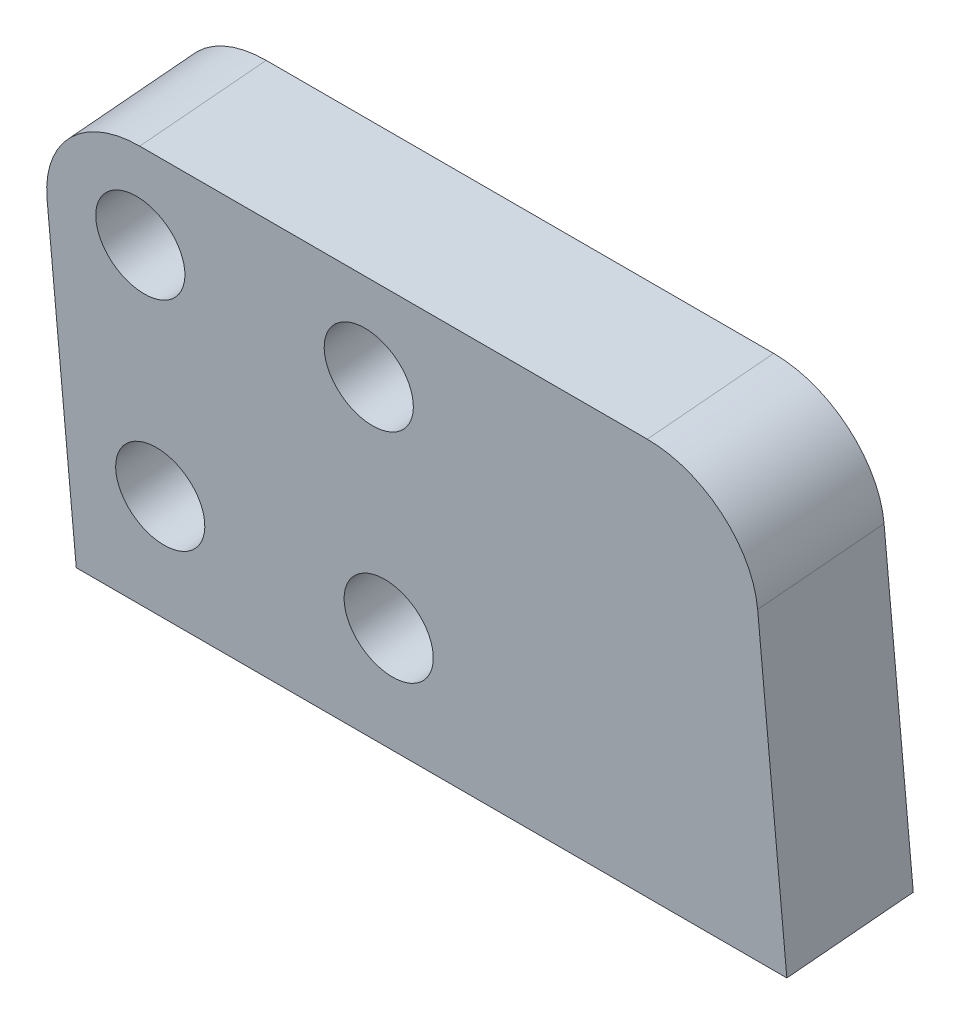
ISO-10303-21;
HEADER;
FILE_DESCRIPTION(('STEP AP214'),'2;1');
FILE_NAME('part.step','',(''),(''),'','','');
FILE_SCHEMA(('AUTOMOTIVE_DESIGN { 1 0 10303 214 1 1 1 1 }'));
ENDSEC;
DATA;
#1=APPLICATION_CONTEXT('core data for automotive mechanical design processes');
#2=APPLICATION_PROTOCOL_DEFINITION('international standard','automotive_design',2000,#1);
#3=PRODUCT_CONTEXT('',#1,'mechanical');
#4=PRODUCT('Part','Part','',(#3));
#5=PRODUCT_RELATED_PRODUCT_CATEGORY('part','',(#4));
#6=PRODUCT_DEFINITION_FORMATION('','',#4);
#7=PRODUCT_DEFINITION_CONTEXT('part definition',#1,'design');
#8=PRODUCT_DEFINITION('design','',#6,#7);
#9=PRODUCT_DEFINITION_SHAPE('','',#8);
#10=(LENGTH_UNIT() NAMED_UNIT(*) SI_UNIT(.MILLI.,.METRE.));
#11=(NAMED_UNIT(*) PLANE_ANGLE_UNIT() SI_UNIT($,.RADIAN.));
#12=(NAMED_UNIT(*) SI_UNIT($,.STERADIAN.) SOLID_ANGLE_UNIT());
#13=UNCERTAINTY_MEASURE_WITH_UNIT(LENGTH_MEASURE(1.E-05),#10,'distance_accuracy_value','');
#14=(GEOMETRIC_REPRESENTATION_CONTEXT(3) GLOBAL_UNCERTAINTY_ASSIGNED_CONTEXT((#13)) GLOBAL_UNIT_ASSIGNED_CONTEXT((#10,
#11,#12)) REPRESENTATION_CONTEXT('',''));
#15=CARTESIAN_POINT('',(0.,0.,0.));
#16=DIRECTION('',(0.,0.,1.));
#17=DIRECTION('',(1.,0.,0.));
#18=AXIS2_PLACEMENT_3D('',#15,#16,#17);
#19=CARTESIAN_POINT('',(-9.39850038185257,-99.6092322077506,29.3696279563749));
#20=DIRECTION('',(0.,0.996194698091746,0.087155742747658));
#21=DIRECTION('',(0.,-0.087155742747658,0.996194698091746));
#22=AXIS2_PLACEMENT_3D('',#19,#20,#21);
#23=PLANE('',#22);
#24=DIRECTION('',(1.,0.,0.));
#25=VECTOR('',#24,1.);
#26=CARTESIAN_POINT('',(-34.0999576101563,-100.480789635227,39.3315749372924));
#27=LINE('',#26,#25);
#28=CARTESIAN_POINT('',(-80.0899576101563,-100.480789635227,39.3315749372924));
#29=VERTEX_POINT('',#28);
#30=CARTESIAN_POINT('',(-24.0999576101563,-100.480789635227,39.3315749372924));
#31=VERTEX_POINT('',#30);
#32=EDGE_CURVE('E50',#29,#31,#27,.T.);
#33=ORIENTED_EDGE('',*,*,#32,.F.);
#34=DIRECTION('',(0.,-0.087155742747658,0.996194698091746));
#35=VECTOR('',#34,1.);
#36=CARTESIAN_POINT('',(-80.0899576101563,-100.480789635227,39.3315749372924));
#37=LINE('',#36,#35);
#38=CARTESIAN_POINT('',(-80.0899576101563,-99.6092322077506,29.3696279563749));
#39=VERTEX_POINT('',#38);
#40=EDGE_CURVE('E134',#39,#29,#37,.T.);
#41=ORIENTED_EDGE('',*,*,#40,.F.);
#42=DIRECTION('',(1.,0.,0.));
#43=VECTOR('',#42,1.);
#44=CARTESIAN_POINT('',(-34.0999576101563,-99.6092322077506,29.3696279563749));
#45=LINE('',#44,#43);
#46=CARTESIAN_POINT('',(-24.0999576101563,-99.6092322077506,29.3696279563749));
#47=VERTEX_POINT('',#46);
#48=EDGE_CURVE('E11',#39,#47,#45,.T.);
#49=ORIENTED_EDGE('',*,*,#48,.T.);
#50=DIRECTION('',(0.,0.087155742747658,-0.996194698091746));
#51=VECTOR('',#50,1.);
#52=CARTESIAN_POINT('',(-24.0999576101563,-100.480789635227,39.3315749372924));
#53=LINE('',#52,#51);
#54=EDGE_CURVE('E44',#31,#47,#53,.T.);
#55=ORIENTED_EDGE('',*,*,#54,.F.);
#56=EDGE_LOOP('',(#33,#41,#49,#55));
#57=FACE_BOUND('',#56,.T.);
#58=ADVANCED_FACE('F41',(#57),#23,.F.);
#59=CARTESIAN_POINT('',(-72.6899576101563,-91.5150373524014,40.1159766220213));
#60=DIRECTION('',(0.,0.087155742747658,-0.996194698091746));
#61=DIRECTION('',(-1.,0.,0.));
#62=AXIS2_PLACEMENT_3D('',#59,#60,#61);
#63=CYLINDRICAL_SURFACE('',#62,3.5);
#64=CARTESIAN_POINT('',(-72.6899576101563,-91.5150373524014,40.1159766220213));
#65=DIRECTION('',(0.,-0.087155742747658,0.996194698091746));
#66=DIRECTION('',(1.,0.,0.));
#67=AXIS2_PLACEMENT_3D('',#64,#65,#66);
#68=CIRCLE('',#67,3.5);
#69=CARTESIAN_POINT('',(-69.1899576101563,-91.5150373524014,40.1159766220213));
#70=VERTEX_POINT('',#69);
#71=EDGE_CURVE('E291',#70,#70,#68,.T.);
#72=ORIENTED_EDGE('',*,*,#71,.T.);
#73=EDGE_LOOP('',(#72));
#74=FACE_BOUND('',#73,.T.);
#75=CARTESIAN_POINT('',(-72.6899576101563,-90.6434799249248,30.1540296411039));
#76=DIRECTION('',(0.,-0.087155742747658,0.996194698091746));
#77=DIRECTION('',(1.,0.,0.));
#78=AXIS2_PLACEMENT_3D('',#75,#76,#77);
#79=CIRCLE('',#78,3.5);
#80=CARTESIAN_POINT('',(-69.1899576101563,-90.6434799249248,30.1540296411039));
#81=VERTEX_POINT('',#80);
#82=EDGE_CURVE('E289',#81,#81,#79,.T.);
#83=ORIENTED_EDGE('',*,*,#82,.F.);
#84=EDGE_LOOP('',(#83));
#85=FACE_BOUND('',#84,.T.);
#86=ADVANCED_FACE('F163',(#74,#85),#63,.F.);
#87=CARTESIAN_POINT('',(-54.6899576101563,-73.58353278675,41.6847799914792));
#88=DIRECTION('',(0.,0.087155742747658,-0.996194698091746));
#89=DIRECTION('',(-1.,0.,0.));
#90=AXIS2_PLACEMENT_3D('',#87,#88,#89);
#91=CYLINDRICAL_SURFACE('',#90,3.5);
#92=CARTESIAN_POINT('',(-54.6899576101563,-73.58353278675,41.6847799914792));
#93=DIRECTION('',(0.,-0.087155742747658,0.996194698091746));
#94=DIRECTION('',(1.,0.,0.));
#95=AXIS2_PLACEMENT_3D('',#92,#93,#94);
#96=CIRCLE('',#95,3.5);
#97=CARTESIAN_POINT('',(-51.1899576101563,-73.58353278675,41.6847799914792));
#98=VERTEX_POINT('',#97);
#99=EDGE_CURVE('E269',#98,#98,#96,.T.);
#100=ORIENTED_EDGE('',*,*,#99,.T.);
#101=EDGE_LOOP('',(#100));
#102=FACE_BOUND('',#101,.T.);
#103=CARTESIAN_POINT('',(-54.6899576101563,-72.7119753592734,31.7228330105617));
#104=DIRECTION('',(0.,-0.087155742747658,0.996194698091746));
#105=DIRECTION('',(1.,0.,0.));
#106=AXIS2_PLACEMENT_3D('',#103,#104,#105);
#107=CIRCLE('',#106,3.5);
#108=CARTESIAN_POINT('',(-51.1899576101563,-72.7119753592734,31.7228330105617));
#109=VERTEX_POINT('',#108);
#110=EDGE_CURVE('E272',#109,#109,#107,.T.);
#111=ORIENTED_EDGE('',*,*,#110,.F.);
#112=EDGE_LOOP('',(#111));
#113=FACE_BOUND('',#112,.T.);
#114=ADVANCED_FACE('F167',(#102,#113),#91,.F.);
#115=CARTESIAN_POINT('',(-54.6899576101563,-91.5150373524014,40.1159766220213));
#116=DIRECTION('',(0.,0.087155742747658,-0.996194698091746));
#117=DIRECTION('',(-1.,0.,0.));
#118=AXIS2_PLACEMENT_3D('',#115,#116,#117);
#119=CYLINDRICAL_SURFACE('',#118,3.5);
#120=CARTESIAN_POINT('',(-54.6899576101563,-91.5150373524014,40.1159766220213));
#121=DIRECTION('',(0.,-0.087155742747658,0.996194698091746));
#122=DIRECTION('',(1.,0.,0.));
#123=AXIS2_PLACEMENT_3D('',#120,#121,#122);
#124=CIRCLE('',#123,3.5);
#125=CARTESIAN_POINT('',(-51.1899576101563,-91.5150373524014,40.1159766220213));
#126=VERTEX_POINT('',#125);
#127=EDGE_CURVE('E100',#126,#126,#124,.T.);
#128=ORIENTED_EDGE('',*,*,#127,.T.);
#129=EDGE_LOOP('',(#128));
#130=FACE_BOUND('',#129,.T.);
#131=CARTESIAN_POINT('',(-54.6899576101563,-90.6434799249248,30.1540296411039));
#132=DIRECTION('',(0.,-0.087155742747658,0.996194698091746));
#133=DIRECTION('',(1.,0.,0.));
#134=AXIS2_PLACEMENT_3D('',#131,#132,#133);
#135=CIRCLE('',#134,3.5);
#136=CARTESIAN_POINT('',(-51.1899576101563,-90.6434799249248,30.1540296411039));
#137=VERTEX_POINT('',#136);
#138=EDGE_CURVE('E149',#137,#137,#135,.T.);
#139=ORIENTED_EDGE('',*,*,#138,.F.);
#140=EDGE_LOOP('',(#139));
#141=FACE_BOUND('',#140,.T.);
#142=ADVANCED_FACE('F187',(#130,#141),#119,.F.);
#143=CARTESIAN_POINT('',(-72.6899576101563,-73.58353278675,41.6847799914792));
#144=DIRECTION('',(0.,0.087155742747658,-0.996194698091746));
#145=DIRECTION('',(-1.,0.,0.));
#146=AXIS2_PLACEMENT_3D('',#143,#144,#145);
#147=CYLINDRICAL_SURFACE('',#146,3.5);
#148=CARTESIAN_POINT('',(-72.6899576101563,-73.58353278675,41.6847799914792));
#149=DIRECTION('',(0.,-0.087155742747658,0.996194698091746));
#150=DIRECTION('',(1.,0.,0.));
#151=AXIS2_PLACEMENT_3D('',#148,#149,#150);
#152=CIRCLE('',#151,3.5);
#153=CARTESIAN_POINT('',(-69.1899576101563,-73.58353278675,41.6847799914792));
#154=VERTEX_POINT('',#153);
#155=EDGE_CURVE('E274',#154,#154,#152,.T.);
#156=ORIENTED_EDGE('',*,*,#155,.T.);
#157=EDGE_LOOP('',(#156));
#158=FACE_BOUND('',#157,.T.);
#159=CARTESIAN_POINT('',(-72.6899576101563,-72.7119753592734,31.7228330105617));
#160=DIRECTION('',(0.,-0.087155742747658,0.996194698091746));
#161=DIRECTION('',(1.,0.,0.));
#162=AXIS2_PLACEMENT_3D('',#159,#160,#161);
#163=CIRCLE('',#162,3.5);
#164=CARTESIAN_POINT('',(-69.1899576101563,-72.7119753592734,31.7228330105617));
#165=VERTEX_POINT('',#164);
#166=EDGE_CURVE('E277',#165,#165,#163,.T.);
#167=ORIENTED_EDGE('',*,*,#166,.F.);
#168=EDGE_LOOP('',(#167));
#169=FACE_BOUND('',#168,.T.);
#170=ADVANCED_FACE('F183',(#158,#169),#147,.F.);
#171=CARTESIAN_POINT('',(-80.0899576101563,-66.2116920208711,42.3297324878118));
#172=DIRECTION('',(0.,-0.996194698091746,-0.087155742747658));
#173=DIRECTION('',(0.,0.087155742747658,-0.996194698091746));
#174=AXIS2_PLACEMENT_3D('',#171,#172,#173);
#175=PLANE('',#174);
#176=DIRECTION('',(-1.,0.,0.));
#177=VECTOR('',#176,1.);
#178=CARTESIAN_POINT('',(-80.0899576101563,-65.3401345933945,32.3677855068944));
#179=LINE('',#178,#177);
#180=CARTESIAN_POINT('',(-32.0999576101563,-65.3401345933945,32.3677855068944));
#181=VERTEX_POINT('',#180);
#182=CARTESIAN_POINT('',(-72.0899576101563,-65.3401345933945,32.3677855068944));
#183=VERTEX_POINT('',#182);
#184=EDGE_CURVE('E99',#181,#183,#179,.T.);
#185=ORIENTED_EDGE('',*,*,#184,.T.);
#186=DIRECTION('',(0.,0.087155742747658,-0.996194698091746));
#187=VECTOR('',#186,1.);
#188=CARTESIAN_POINT('',(-72.0899576101563,-66.2116920208711,42.3297324878118));
#189=LINE('',#188,#187);
#190=CARTESIAN_POINT('',(-72.0899576101563,-66.2116920208711,42.3297324878118));
#191=VERTEX_POINT('',#190);
#192=EDGE_CURVE('E132',#183,#191,#189,.F.);
#193=ORIENTED_EDGE('',*,*,#192,.T.);
#194=DIRECTION('',(-1.,0.,0.));
#195=VECTOR('',#194,1.);
#196=CARTESIAN_POINT('',(-80.0899576101563,-66.2116920208711,42.3297324878118));
#197=LINE('',#196,#195);
#198=CARTESIAN_POINT('',(-32.0999576101563,-66.2116920208711,42.3297324878118));
#199=VERTEX_POINT('',#198);
#200=EDGE_CURVE('E117',#199,#191,#197,.T.);
#201=ORIENTED_EDGE('',*,*,#200,.F.);
#202=DIRECTION('',(0.,0.087155742747658,-0.996194698091746));
#203=VECTOR('',#202,1.);
#204=CARTESIAN_POINT('',(-32.0999576101563,-66.2116920208711,42.3297324878118));
#205=LINE('',#204,#203);
#206=EDGE_CURVE('E130',#199,#181,#205,.T.);
#207=ORIENTED_EDGE('',*,*,#206,.T.);
#208=EDGE_LOOP('',(#185,#193,#201,#207));
#209=FACE_BOUND('',#208,.T.);
#210=ADVANCED_FACE('F153',(#209),#175,.F.);
#211=CARTESIAN_POINT('',(-32.0999576101563,-74.1812496056051,41.6324865458306));
#212=DIRECTION('',(0.,0.087155742747658,-0.996194698091746));
#213=DIRECTION('',(-1.,0.,0.));
#214=AXIS2_PLACEMENT_3D('',#211,#212,#213);
#215=CYLINDRICAL_SURFACE('',#214,8.);
#216=CARTESIAN_POINT('',(-32.0999576101563,-74.1812496056051,41.6324865458306));
#217=DIRECTION('',(0.,0.087155742747658,-0.996194698091746));
#218=DIRECTION('',(-1.,0.,0.));
#219=AXIS2_PLACEMENT_3D('',#216,#217,#218);
#220=CIRCLE('',#219,8.);
#221=CARTESIAN_POINT('',(-24.0999576101563,-74.1812496056051,41.6324865458306));
#222=VERTEX_POINT('',#221);
#223=EDGE_CURVE('E113',#222,#199,#220,.F.);
#224=ORIENTED_EDGE('',*,*,#223,.F.);
#225=DIRECTION('',(0.,0.087155742747658,-0.996194698091746));
#226=VECTOR('',#225,1.);
#227=CARTESIAN_POINT('',(-24.0999576101563,-74.1812496056051,41.6324865458306));
#228=LINE('',#227,#226);
#229=CARTESIAN_POINT('',(-24.0999576101563,-73.3096921781285,31.6705395649131));
#230=VERTEX_POINT('',#229);
#231=EDGE_CURVE('E96',#230,#222,#228,.F.);
#232=ORIENTED_EDGE('',*,*,#231,.F.);
#233=CARTESIAN_POINT('',(-32.0999576101563,-73.3096921781285,31.6705395649131));
#234=DIRECTION('',(0.,0.087155742747658,-0.996194698091746));
#235=DIRECTION('',(-1.,0.,0.));
#236=AXIS2_PLACEMENT_3D('',#233,#234,#235);
#237=CIRCLE('',#236,8.);
#238=EDGE_CURVE('E103',#181,#230,#237,.T.);
#239=ORIENTED_EDGE('',*,*,#238,.F.);
#240=ORIENTED_EDGE('',*,*,#206,.F.);
#241=EDGE_LOOP('',(#224,#232,#239,#240));
#242=FACE_BOUND('',#241,.T.);
#243=ADVANCED_FACE('F112',(#242),#215,.T.);
#244=CARTESIAN_POINT('',(-72.0899576101563,-74.1812496056051,41.6324865458306));
#245=DIRECTION('',(0.,0.087155742747658,-0.996194698091746));
#246=DIRECTION('',(-1.,0.,0.));
#247=AXIS2_PLACEMENT_3D('',#244,#245,#246);
#248=CYLINDRICAL_SURFACE('',#247,8.);
#249=CARTESIAN_POINT('',(-72.0899576101563,-74.1812496056051,41.6324865458306));
#250=DIRECTION('',(0.,0.087155742747658,-0.996194698091746));
#251=DIRECTION('',(-1.,0.,0.));
#252=AXIS2_PLACEMENT_3D('',#249,#250,#251);
#253=CIRCLE('',#252,8.);
#254=CARTESIAN_POINT('',(-80.0899576101563,-74.1812496056051,41.6324865458306));
#255=VERTEX_POINT('',#254);
#256=EDGE_CURVE('E125',#191,#255,#253,.F.);
#257=ORIENTED_EDGE('',*,*,#256,.F.);
#258=ORIENTED_EDGE('',*,*,#192,.F.);
#259=CARTESIAN_POINT('',(-72.0899576101563,-73.3096921781285,31.6705395649131));
#260=DIRECTION('',(0.,0.087155742747658,-0.996194698091746));
#261=DIRECTION('',(-1.,0.,0.));
#262=AXIS2_PLACEMENT_3D('',#259,#260,#261);
#263=CIRCLE('',#262,8.);
#264=CARTESIAN_POINT('',(-80.0899576101563,-73.3096921781285,31.6705395649131));
#265=VERTEX_POINT('',#264);
#266=EDGE_CURVE('E110',#265,#183,#263,.T.);
#267=ORIENTED_EDGE('',*,*,#266,.F.);
#268=DIRECTION('',(0.,0.087155742747658,-0.996194698091746));
#269=VECTOR('',#268,1.);
#270=CARTESIAN_POINT('',(-80.0899576101563,-74.1812496056051,41.6324865458306));
#271=LINE('',#270,#269);
#272=EDGE_CURVE('E127',#255,#265,#271,.T.);
#273=ORIENTED_EDGE('',*,*,#272,.F.);
#274=EDGE_LOOP('',(#257,#258,#267,#273));
#275=FACE_BOUND('',#274,.T.);
#276=ADVANCED_FACE('F157',(#275),#248,.T.);
#277=CARTESIAN_POINT('',(-34.0999576101563,-141.324772256989,35.7581894846384));
#278=DIRECTION('',(0.,0.087155742747658,-0.996194698091746));
#279=DIRECTION('',(-1.,0.,0.));
#280=AXIS2_PLACEMENT_3D('',#277,#278,#279);
#281=PLANE('',#280);
#282=DIRECTION('',(0.,-0.996194698091746,-0.087155742747658));
#283=VECTOR('',#282,1.);
#284=CARTESIAN_POINT('',(-80.0899576101563,-153.777205983136,34.6687427002927));
#285=LINE('',#284,#283);
#286=EDGE_CURVE('E114',#255,#29,#285,.T.);
#287=ORIENTED_EDGE('',*,*,#286,.T.);
#288=ORIENTED_EDGE('',*,*,#32,.T.);
#289=DIRECTION('',(0.,0.996194698091746,0.087155742747658));
#290=VECTOR('',#289,1.);
#291=CARTESIAN_POINT('',(-24.0999576101563,-66.2116920208711,42.3297324878118));
#292=LINE('',#291,#290);
#293=EDGE_CURVE('E141',#31,#222,#292,.T.);
#294=ORIENTED_EDGE('',*,*,#293,.T.);
#295=ORIENTED_EDGE('',*,*,#223,.T.);
#296=ORIENTED_EDGE('',*,*,#200,.T.);
#297=ORIENTED_EDGE('',*,*,#256,.T.);
#298=EDGE_LOOP('',(#287,#288,#294,#295,#296,#297));
#299=FACE_BOUND('',#298,.T.);
#300=ORIENTED_EDGE('',*,*,#127,.F.);
#301=EDGE_LOOP('',(#300));
#302=FACE_BOUND('',#301,.T.);
#303=ORIENTED_EDGE('',*,*,#99,.F.);
#304=EDGE_LOOP('',(#303));
#305=FACE_BOUND('',#304,.T.);
#306=ORIENTED_EDGE('',*,*,#155,.F.);
#307=EDGE_LOOP('',(#306));
#308=FACE_BOUND('',#307,.T.);
#309=ORIENTED_EDGE('',*,*,#71,.F.);
#310=EDGE_LOOP('',(#309));
#311=FACE_BOUND('',#310,.T.);
#312=ADVANCED_FACE('F139',(#299,#302,#305,#308,#311),#281,.F.);
#313=CARTESIAN_POINT('',(-34.0999576101563,-140.453214829512,25.796242503721));
#314=DIRECTION('',(0.,0.087155742747658,-0.996194698091746));
#315=DIRECTION('',(-1.,0.,0.));
#316=AXIS2_PLACEMENT_3D('',#313,#314,#315);
#317=PLANE('',#316);
#318=ORIENTED_EDGE('',*,*,#48,.F.);
#319=DIRECTION('',(0.,-0.996194698091746,-0.087155742747658));
#320=VECTOR('',#319,1.);
#321=CARTESIAN_POINT('',(-80.0899576101563,-152.905648555659,24.7067957193752));
#322=LINE('',#321,#320);
#323=EDGE_CURVE('E120',#265,#39,#322,.T.);
#324=ORIENTED_EDGE('',*,*,#323,.F.);
#325=ORIENTED_EDGE('',*,*,#266,.T.);
#326=ORIENTED_EDGE('',*,*,#184,.F.);
#327=ORIENTED_EDGE('',*,*,#238,.T.);
#328=DIRECTION('',(0.,0.996194698091746,0.087155742747658));
#329=VECTOR('',#328,1.);
#330=CARTESIAN_POINT('',(-24.0999576101563,-65.3401345933945,32.3677855068944));
#331=LINE('',#330,#329);
#332=EDGE_CURVE('E92',#47,#230,#331,.T.);
#333=ORIENTED_EDGE('',*,*,#332,.F.);
#334=EDGE_LOOP('',(#318,#324,#325,#326,#327,#333));
#335=FACE_BOUND('',#334,.T.);
#336=ORIENTED_EDGE('',*,*,#166,.T.);
#337=EDGE_LOOP('',(#336));
#338=FACE_BOUND('',#337,.T.);
#339=ORIENTED_EDGE('',*,*,#138,.T.);
#340=EDGE_LOOP('',(#339));
#341=FACE_BOUND('',#340,.T.);
#342=ORIENTED_EDGE('',*,*,#110,.T.);
#343=EDGE_LOOP('',(#342));
#344=FACE_BOUND('',#343,.T.);
#345=ORIENTED_EDGE('',*,*,#82,.T.);
#346=EDGE_LOOP('',(#345));
#347=FACE_BOUND('',#346,.T.);
#348=ADVANCED_FACE('F104',(#335,#338,#341,#344,#347),#317,.T.);
#349=CARTESIAN_POINT('',(-80.0899576101563,-153.777205983136,34.6687427002927));
#350=DIRECTION('',(1.,0.,0.));
#351=DIRECTION('',(0.,0.087155742747658,-0.996194698091746));
#352=AXIS2_PLACEMENT_3D('',#349,#350,#351);
#353=PLANE('',#352);
#354=ORIENTED_EDGE('',*,*,#323,.T.);
#355=ORIENTED_EDGE('',*,*,#40,.T.);
#356=ORIENTED_EDGE('',*,*,#286,.F.);
#357=ORIENTED_EDGE('',*,*,#272,.T.);
#358=EDGE_LOOP('',(#354,#355,#356,#357));
#359=FACE_BOUND('',#358,.T.);
#360=ADVANCED_FACE('F160',(#359),#353,.F.);
#361=CARTESIAN_POINT('',(-24.0999576101563,-66.2116920208711,42.3297324878118));
#362=DIRECTION('',(-1.,0.,0.));
#363=DIRECTION('',(0.,-0.996194698091746,-0.087155742747658));
#364=AXIS2_PLACEMENT_3D('',#361,#362,#363);
#365=PLANE('',#364);
#366=ORIENTED_EDGE('',*,*,#293,.F.);
#367=ORIENTED_EDGE('',*,*,#54,.T.);
#368=ORIENTED_EDGE('',*,*,#332,.T.);
#369=ORIENTED_EDGE('',*,*,#231,.T.);
#370=EDGE_LOOP('',(#366,#367,#368,#369));
#371=FACE_BOUND('',#370,.T.);
#372=ADVANCED_FACE('F94',(#371),#365,.F.);
#373=CLOSED_SHELL('',(#58,#86,#114,#142,#170,#210,#243,#276,#312,#348,#360,#372));
#374=MANIFOLD_SOLID_BREP('B2',#373);
#375=ADVANCED_BREP_SHAPE_REPRESENTATION('',(#18,#374),#14);
#376=SHAPE_DEFINITION_REPRESENTATION(#9,#375);
ENDSEC;
END-ISO-10303-21;
